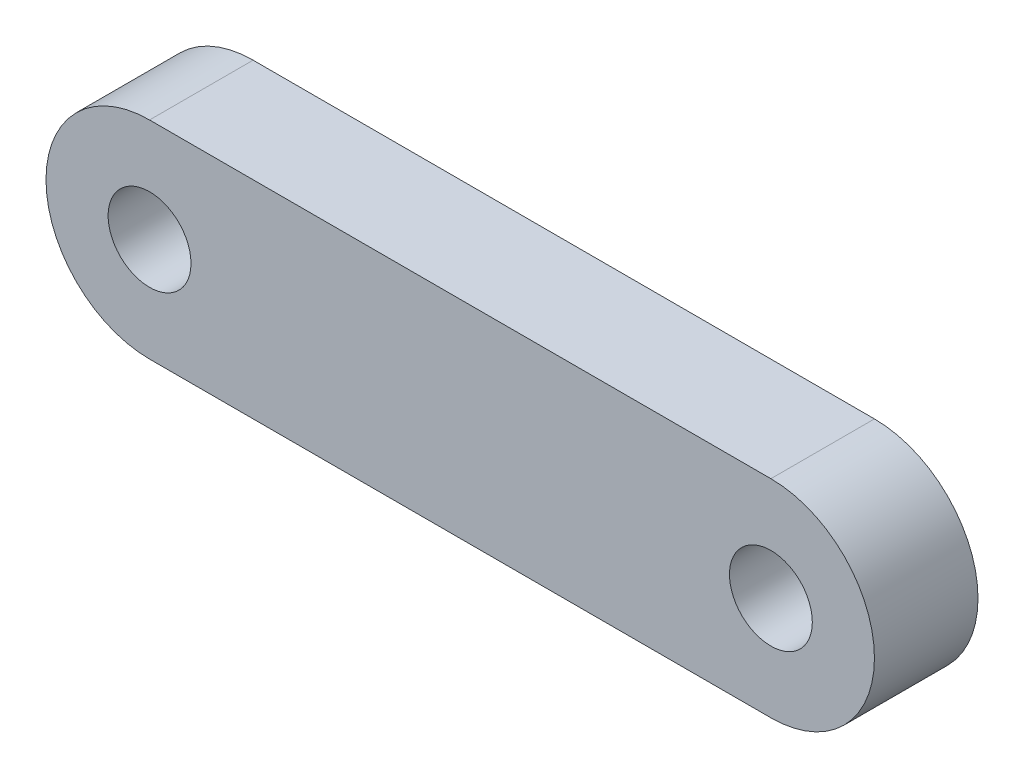
ISO-10303-21;
HEADER;
FILE_DESCRIPTION(('STEP AP214'),'2;1');
FILE_NAME('part.step','',(''),(''),'','','');
FILE_SCHEMA(('AUTOMOTIVE_DESIGN { 1 0 10303 214 1 1 1 1 }'));
ENDSEC;
DATA;
#1=APPLICATION_CONTEXT('core data for automotive mechanical design processes');
#2=APPLICATION_PROTOCOL_DEFINITION('international standard','automotive_design',2000,#1);
#3=PRODUCT_CONTEXT('',#1,'mechanical');
#4=PRODUCT('Part','Part','',(#3));
#5=PRODUCT_RELATED_PRODUCT_CATEGORY('part','',(#4));
#6=PRODUCT_DEFINITION_FORMATION('','',#4);
#7=PRODUCT_DEFINITION_CONTEXT('part definition',#1,'design');
#8=PRODUCT_DEFINITION('design','',#6,#7);
#9=PRODUCT_DEFINITION_SHAPE('','',#8);
#10=(LENGTH_UNIT() NAMED_UNIT(*) SI_UNIT(.MILLI.,.METRE.));
#11=(NAMED_UNIT(*) PLANE_ANGLE_UNIT() SI_UNIT($,.RADIAN.));
#12=(NAMED_UNIT(*) SI_UNIT($,.STERADIAN.) SOLID_ANGLE_UNIT());
#13=UNCERTAINTY_MEASURE_WITH_UNIT(LENGTH_MEASURE(1.E-05),#10,'distance_accuracy_value','');
#14=(GEOMETRIC_REPRESENTATION_CONTEXT(3) GLOBAL_UNCERTAINTY_ASSIGNED_CONTEXT((#13)) GLOBAL_UNIT_ASSIGNED_CONTEXT((#10,
#11,#12)) REPRESENTATION_CONTEXT('',''));
#15=CARTESIAN_POINT('',(0.,0.,0.));
#16=DIRECTION('',(0.,0.,1.));
#17=DIRECTION('',(1.,0.,0.));
#18=AXIS2_PLACEMENT_3D('',#15,#16,#17);
#19=CARTESIAN_POINT('',(-30.,0.,5.));
#20=DIRECTION('',(0.,0.,-1.));
#21=DIRECTION('',(-1.,0.,0.));
#22=AXIS2_PLACEMENT_3D('',#19,#20,#21);
#23=CYLINDRICAL_SURFACE('',#22,10.);
#24=CARTESIAN_POINT('',(-30.,0.,-5.));
#25=DIRECTION('',(0.,0.,1.));
#26=DIRECTION('',(1.,0.,0.));
#27=AXIS2_PLACEMENT_3D('',#24,#25,#26);
#28=CIRCLE('',#27,10.);
#29=CARTESIAN_POINT('',(-30.,10.,-5.));
#30=VERTEX_POINT('',#29);
#31=CARTESIAN_POINT('',(-30.,-10.,-5.));
#32=VERTEX_POINT('',#31);
#33=EDGE_CURVE('E102',#30,#32,#28,.T.);
#34=ORIENTED_EDGE('',*,*,#33,.T.);
#35=DIRECTION('',(0.,0.,-1.));
#36=VECTOR('',#35,1.);
#37=CARTESIAN_POINT('',(-30.,-10.,5.));
#38=LINE('',#37,#36);
#39=CARTESIAN_POINT('',(-30.,-10.,5.));
#40=VERTEX_POINT('',#39);
#41=EDGE_CURVE('E11',#40,#32,#38,.T.);
#42=ORIENTED_EDGE('',*,*,#41,.F.);
#43=CARTESIAN_POINT('',(-30.,0.,5.));
#44=DIRECTION('',(0.,0.,1.));
#45=DIRECTION('',(1.,0.,0.));
#46=AXIS2_PLACEMENT_3D('',#43,#44,#45);
#47=CIRCLE('',#46,10.);
#48=CARTESIAN_POINT('',(-30.,10.,5.));
#49=VERTEX_POINT('',#48);
#50=EDGE_CURVE('E90',#49,#40,#47,.T.);
#51=ORIENTED_EDGE('',*,*,#50,.F.);
#52=DIRECTION('',(0.,0.,-1.));
#53=VECTOR('',#52,1.);
#54=CARTESIAN_POINT('',(-30.,10.,5.));
#55=LINE('',#54,#53);
#56=EDGE_CURVE('E98',#49,#30,#55,.T.);
#57=ORIENTED_EDGE('',*,*,#56,.T.);
#58=EDGE_LOOP('',(#34,#42,#51,#57));
#59=FACE_BOUND('',#58,.T.);
#60=ADVANCED_FACE('F39',(#59),#23,.T.);
#61=CARTESIAN_POINT('',(-30.,-10.,5.));
#62=DIRECTION('',(0.,1.,0.));
#63=DIRECTION('',(-1.,0.,0.));
#64=AXIS2_PLACEMENT_3D('',#61,#62,#63);
#65=PLANE('',#64);
#66=DIRECTION('',(1.,0.,0.));
#67=VECTOR('',#66,1.);
#68=CARTESIAN_POINT('',(-30.,-10.,-5.));
#69=LINE('',#68,#67);
#70=CARTESIAN_POINT('',(30.,-9.99999999999999,-5.));
#71=VERTEX_POINT('',#70);
#72=EDGE_CURVE('E94',#32,#71,#69,.T.);
#73=ORIENTED_EDGE('',*,*,#72,.T.);
#74=DIRECTION('',(0.,0.,-1.));
#75=VECTOR('',#74,1.);
#76=CARTESIAN_POINT('',(30.,-9.99999999999999,5.));
#77=LINE('',#76,#75);
#78=CARTESIAN_POINT('',(30.,-9.99999999999999,5.));
#79=VERTEX_POINT('',#78);
#80=EDGE_CURVE('E47',#79,#71,#77,.T.);
#81=ORIENTED_EDGE('',*,*,#80,.F.);
#82=DIRECTION('',(1.,0.,0.));
#83=VECTOR('',#82,1.);
#84=CARTESIAN_POINT('',(-30.,-10.,5.));
#85=LINE('',#84,#83);
#86=EDGE_CURVE('E85',#40,#79,#85,.T.);
#87=ORIENTED_EDGE('',*,*,#86,.F.);
#88=ORIENTED_EDGE('',*,*,#41,.T.);
#89=EDGE_LOOP('',(#73,#81,#87,#88));
#90=FACE_BOUND('',#89,.T.);
#91=ADVANCED_FACE('F93',(#90),#65,.F.);
#92=CARTESIAN_POINT('',(30.,0.,5.));
#93=DIRECTION('',(0.,0.,-1.));
#94=DIRECTION('',(-1.,0.,0.));
#95=AXIS2_PLACEMENT_3D('',#92,#93,#94);
#96=CYLINDRICAL_SURFACE('',#95,10.);
#97=CARTESIAN_POINT('',(30.,0.,-5.));
#98=DIRECTION('',(0.,0.,1.));
#99=DIRECTION('',(1.,0.,0.));
#100=AXIS2_PLACEMENT_3D('',#97,#98,#99);
#101=CIRCLE('',#100,10.);
#102=CARTESIAN_POINT('',(30.,10.,-5.));
#103=VERTEX_POINT('',#102);
#104=EDGE_CURVE('E72',#71,#103,#101,.T.);
#105=ORIENTED_EDGE('',*,*,#104,.T.);
#106=DIRECTION('',(0.,0.,-1.));
#107=VECTOR('',#106,1.);
#108=CARTESIAN_POINT('',(30.,10.,5.));
#109=LINE('',#108,#107);
#110=CARTESIAN_POINT('',(30.,10.,5.));
#111=VERTEX_POINT('',#110);
#112=EDGE_CURVE('E95',#111,#103,#109,.T.);
#113=ORIENTED_EDGE('',*,*,#112,.F.);
#114=CARTESIAN_POINT('',(30.,0.,5.));
#115=DIRECTION('',(0.,0.,1.));
#116=DIRECTION('',(1.,0.,0.));
#117=AXIS2_PLACEMENT_3D('',#114,#115,#116);
#118=CIRCLE('',#117,10.);
#119=EDGE_CURVE('E88',#79,#111,#118,.T.);
#120=ORIENTED_EDGE('',*,*,#119,.F.);
#121=ORIENTED_EDGE('',*,*,#80,.T.);
#122=EDGE_LOOP('',(#105,#113,#120,#121));
#123=FACE_BOUND('',#122,.T.);
#124=ADVANCED_FACE('F96',(#123),#96,.T.);
#125=CARTESIAN_POINT('',(-30.,10.,5.));
#126=DIRECTION('',(0.,-1.,0.));
#127=DIRECTION('',(1.,0.,0.));
#128=AXIS2_PLACEMENT_3D('',#125,#126,#127);
#129=PLANE('',#128);
#130=DIRECTION('',(-1.,0.,0.));
#131=VECTOR('',#130,1.);
#132=CARTESIAN_POINT('',(-30.,10.,-5.));
#133=LINE('',#132,#131);
#134=EDGE_CURVE('E78',#103,#30,#133,.T.);
#135=ORIENTED_EDGE('',*,*,#134,.T.);
#136=ORIENTED_EDGE('',*,*,#56,.F.);
#137=DIRECTION('',(-1.,0.,0.));
#138=VECTOR('',#137,1.);
#139=CARTESIAN_POINT('',(-30.,10.,5.));
#140=LINE('',#139,#138);
#141=EDGE_CURVE('E55',#111,#49,#140,.T.);
#142=ORIENTED_EDGE('',*,*,#141,.F.);
#143=ORIENTED_EDGE('',*,*,#112,.T.);
#144=EDGE_LOOP('',(#135,#136,#142,#143));
#145=FACE_BOUND('',#144,.T.);
#146=ADVANCED_FACE('F110',(#145),#129,.F.);
#147=CARTESIAN_POINT('',(-30.,0.,5.));
#148=DIRECTION('',(0.,0.,1.));
#149=DIRECTION('',(1.,0.,0.));
#150=AXIS2_PLACEMENT_3D('',#147,#148,#149);
#151=PLANE('',#150);
#152=CARTESIAN_POINT('',(-30.,0.,5.));
#153=DIRECTION('',(0.,0.,1.));
#154=DIRECTION('',(1.,0.,0.));
#155=AXIS2_PLACEMENT_3D('',#152,#153,#154);
#156=CIRCLE('',#155,3.99999999999999);
#157=CARTESIAN_POINT('',(-26.,0.,5.));
#158=VERTEX_POINT('',#157);
#159=EDGE_CURVE('E124',#158,#158,#156,.T.);
#160=ORIENTED_EDGE('',*,*,#159,.F.);
#161=EDGE_LOOP('',(#160));
#162=FACE_BOUND('',#161,.T.);
#163=CARTESIAN_POINT('',(30.,0.,5.));
#164=DIRECTION('',(0.,0.,1.));
#165=DIRECTION('',(1.,0.,0.));
#166=AXIS2_PLACEMENT_3D('',#163,#164,#165);
#167=CIRCLE('',#166,3.99999999999999);
#168=CARTESIAN_POINT('',(34.,0.,5.));
#169=VERTEX_POINT('',#168);
#170=EDGE_CURVE('E118',#169,#169,#167,.T.);
#171=ORIENTED_EDGE('',*,*,#170,.F.);
#172=EDGE_LOOP('',(#171));
#173=FACE_BOUND('',#172,.T.);
#174=ORIENTED_EDGE('',*,*,#50,.T.);
#175=ORIENTED_EDGE('',*,*,#86,.T.);
#176=ORIENTED_EDGE('',*,*,#119,.T.);
#177=ORIENTED_EDGE('',*,*,#141,.T.);
#178=EDGE_LOOP('',(#174,#175,#176,#177));
#179=FACE_BOUND('',#178,.T.);
#180=ADVANCED_FACE('F86',(#162,#173,#179),#151,.T.);
#181=CARTESIAN_POINT('',(-30.,0.,-5.));
#182=DIRECTION('',(0.,0.,1.));
#183=DIRECTION('',(1.,0.,0.));
#184=AXIS2_PLACEMENT_3D('',#181,#182,#183);
#185=PLANE('',#184);
#186=CARTESIAN_POINT('',(-30.,0.,-5.));
#187=DIRECTION('',(0.,0.,1.));
#188=DIRECTION('',(1.,0.,0.));
#189=AXIS2_PLACEMENT_3D('',#186,#187,#188);
#190=CIRCLE('',#189,4.);
#191=CARTESIAN_POINT('',(-26.,0.,-5.));
#192=VERTEX_POINT('',#191);
#193=EDGE_CURVE('E121',#192,#192,#190,.T.);
#194=ORIENTED_EDGE('',*,*,#193,.T.);
#195=EDGE_LOOP('',(#194));
#196=FACE_BOUND('',#195,.T.);
#197=CARTESIAN_POINT('',(30.,0.,-5.));
#198=DIRECTION('',(0.,0.,1.));
#199=DIRECTION('',(1.,0.,0.));
#200=AXIS2_PLACEMENT_3D('',#197,#198,#199);
#201=CIRCLE('',#200,4.);
#202=CARTESIAN_POINT('',(34.,0.,-5.));
#203=VERTEX_POINT('',#202);
#204=EDGE_CURVE('E105',#203,#203,#201,.T.);
#205=ORIENTED_EDGE('',*,*,#204,.T.);
#206=EDGE_LOOP('',(#205));
#207=FACE_BOUND('',#206,.T.);
#208=ORIENTED_EDGE('',*,*,#33,.F.);
#209=ORIENTED_EDGE('',*,*,#134,.F.);
#210=ORIENTED_EDGE('',*,*,#104,.F.);
#211=ORIENTED_EDGE('',*,*,#72,.F.);
#212=EDGE_LOOP('',(#208,#209,#210,#211));
#213=FACE_BOUND('',#212,.T.);
#214=ADVANCED_FACE('F113',(#196,#207,#213),#185,.F.);
#215=CARTESIAN_POINT('',(30.,0.,5.));
#216=DIRECTION('',(0.,0.,1.));
#217=DIRECTION('',(1.,0.,0.));
#218=AXIS2_PLACEMENT_3D('',#215,#216,#217);
#219=CYLINDRICAL_SURFACE('',#218,3.99999999999999);
#220=ORIENTED_EDGE('',*,*,#204,.F.);
#221=EDGE_LOOP('',(#220));
#222=FACE_BOUND('',#221,.T.);
#223=ORIENTED_EDGE('',*,*,#170,.T.);
#224=EDGE_LOOP('',(#223));
#225=FACE_BOUND('',#224,.T.);
#226=ADVANCED_FACE('F135',(#222,#225),#219,.F.);
#227=CARTESIAN_POINT('',(-30.,0.,5.));
#228=DIRECTION('',(0.,0.,1.));
#229=DIRECTION('',(1.,0.,0.));
#230=AXIS2_PLACEMENT_3D('',#227,#228,#229);
#231=CYLINDRICAL_SURFACE('',#230,3.99999999999999);
#232=ORIENTED_EDGE('',*,*,#193,.F.);
#233=EDGE_LOOP('',(#232));
#234=FACE_BOUND('',#233,.T.);
#235=ORIENTED_EDGE('',*,*,#159,.T.);
#236=EDGE_LOOP('',(#235));
#237=FACE_BOUND('',#236,.T.);
#238=ADVANCED_FACE('F128',(#234,#237),#231,.F.);
#239=CLOSED_SHELL('',(#60,#91,#124,#146,#180,#214,#226,#238));
#240=MANIFOLD_SOLID_BREP('B2',#239);
#241=ADVANCED_BREP_SHAPE_REPRESENTATION('',(#18,#240),#14);
#242=SHAPE_DEFINITION_REPRESENTATION(#9,#241);
ENDSEC;
END-ISO-10303-21;
